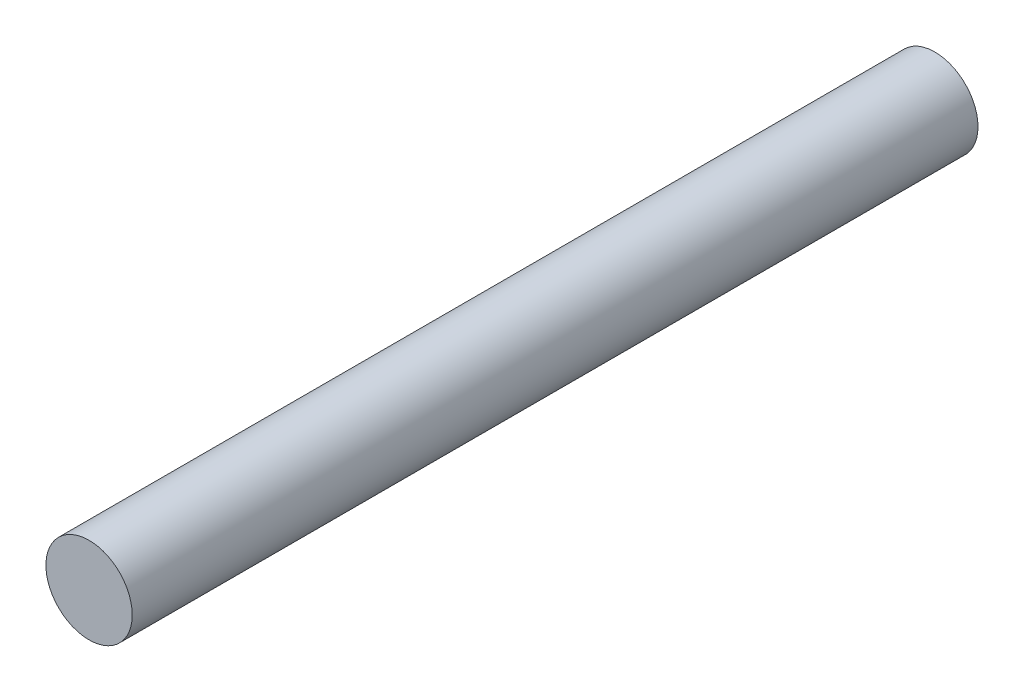
ISO-10303-21;
HEADER;
FILE_DESCRIPTION(('STEP AP214'),'2;1');
FILE_NAME('part.step','',(''),(''),'','','');
FILE_SCHEMA(('AUTOMOTIVE_DESIGN { 1 0 10303 214 1 1 1 1 }'));
ENDSEC;
DATA;
#1=APPLICATION_CONTEXT('core data for automotive mechanical design processes');
#2=APPLICATION_PROTOCOL_DEFINITION('international standard','automotive_design',2000,#1);
#3=PRODUCT_CONTEXT('',#1,'mechanical');
#4=PRODUCT('Part','Part','',(#3));
#5=PRODUCT_RELATED_PRODUCT_CATEGORY('part','',(#4));
#6=PRODUCT_DEFINITION_FORMATION('','',#4);
#7=PRODUCT_DEFINITION_CONTEXT('part definition',#1,'design');
#8=PRODUCT_DEFINITION('design','',#6,#7);
#9=PRODUCT_DEFINITION_SHAPE('','',#8);
#10=(LENGTH_UNIT() NAMED_UNIT(*) SI_UNIT(.MILLI.,.METRE.));
#11=(NAMED_UNIT(*) PLANE_ANGLE_UNIT() SI_UNIT($,.RADIAN.));
#12=(NAMED_UNIT(*) SI_UNIT($,.STERADIAN.) SOLID_ANGLE_UNIT());
#13=UNCERTAINTY_MEASURE_WITH_UNIT(LENGTH_MEASURE(1.E-05),#10,'distance_accuracy_value','');
#14=(GEOMETRIC_REPRESENTATION_CONTEXT(3) GLOBAL_UNCERTAINTY_ASSIGNED_CONTEXT((#13)) GLOBAL_UNIT_ASSIGNED_CONTEXT((#10,
#11,#12)) REPRESENTATION_CONTEXT('',''));
#15=CARTESIAN_POINT('',(0.,0.,0.));
#16=DIRECTION('',(0.,0.,1.));
#17=DIRECTION('',(1.,0.,0.));
#18=AXIS2_PLACEMENT_3D('',#15,#16,#17);
#19=CARTESIAN_POINT('',(0.,0.,49.));
#20=DIRECTION('',(0.,0.,-1.));
#21=DIRECTION('',(-1.,0.,0.));
#22=AXIS2_PLACEMENT_3D('',#19,#20,#21);
#23=CYLINDRICAL_SURFACE('',#22,2.5);
#24=CARTESIAN_POINT('',(0.,0.,49.));
#25=DIRECTION('',(0.,0.,1.));
#26=DIRECTION('',(1.,0.,0.));
#27=AXIS2_PLACEMENT_3D('',#24,#25,#26);
#28=CIRCLE('',#27,2.5);
#29=CARTESIAN_POINT('',(2.5,0.,49.));
#30=VERTEX_POINT('',#29);
#31=EDGE_CURVE('E10',#30,#30,#28,.T.);
#32=ORIENTED_EDGE('',*,*,#31,.F.);
#33=EDGE_LOOP('',(#32));
#34=FACE_BOUND('',#33,.T.);
#35=CARTESIAN_POINT('',(0.,0.,0.));
#36=DIRECTION('',(0.,0.,1.));
#37=DIRECTION('',(1.,0.,0.));
#38=AXIS2_PLACEMENT_3D('',#35,#36,#37);
#39=CIRCLE('',#38,2.5);
#40=CARTESIAN_POINT('',(2.5,0.,0.));
#41=VERTEX_POINT('',#40);
#42=EDGE_CURVE('E37',#41,#41,#39,.T.);
#43=ORIENTED_EDGE('',*,*,#42,.T.);
#44=EDGE_LOOP('',(#43));
#45=FACE_BOUND('',#44,.T.);
#46=ADVANCED_FACE('F34',(#34,#45),#23,.T.);
#47=CARTESIAN_POINT('',(0.,0.,49.));
#48=DIRECTION('',(0.,0.,1.));
#49=DIRECTION('',(1.,0.,0.));
#50=AXIS2_PLACEMENT_3D('',#47,#48,#49);
#51=PLANE('',#50);
#52=ORIENTED_EDGE('',*,*,#31,.T.);
#53=EDGE_LOOP('',(#52));
#54=FACE_BOUND('',#53,.T.);
#55=ADVANCED_FACE('F49',(#54),#51,.T.);
#56=CARTESIAN_POINT('',(0.,0.,0.));
#57=DIRECTION('',(0.,0.,1.));
#58=DIRECTION('',(1.,0.,0.));
#59=AXIS2_PLACEMENT_3D('',#56,#57,#58);
#60=PLANE('',#59);
#61=ORIENTED_EDGE('',*,*,#42,.F.);
#62=EDGE_LOOP('',(#61));
#63=FACE_BOUND('',#62,.T.);
#64=ADVANCED_FACE('F47',(#63),#60,.F.);
#65=CLOSED_SHELL('',(#46,#55,#64));
#66=MANIFOLD_SOLID_BREP('B2',#65);
#67=ADVANCED_BREP_SHAPE_REPRESENTATION('',(#18,#66),#14);
#68=SHAPE_DEFINITION_REPRESENTATION(#9,#67);
ENDSEC;
END-ISO-10303-21;
